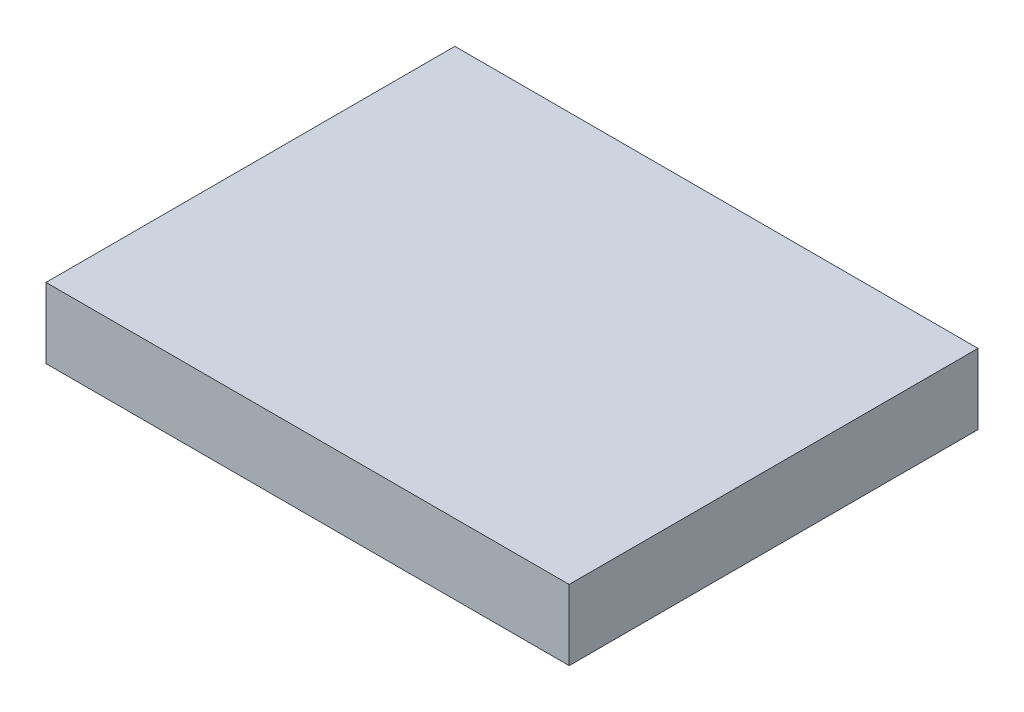
ISO-10303-21;
HEADER;
FILE_DESCRIPTION(('STEP AP214'),'2;1');
FILE_NAME('part.step','',(''),(''),'','','');
FILE_SCHEMA(('AUTOMOTIVE_DESIGN { 1 0 10303 214 1 1 1 1 }'));
ENDSEC;
DATA;
#1=APPLICATION_CONTEXT('core data for automotive mechanical design processes');
#2=APPLICATION_PROTOCOL_DEFINITION('international standard','automotive_design',2000,#1);
#3=PRODUCT_CONTEXT('',#1,'mechanical');
#4=PRODUCT('Part','Part','',(#3));
#5=PRODUCT_RELATED_PRODUCT_CATEGORY('part','',(#4));
#6=PRODUCT_DEFINITION_FORMATION('','',#4);
#7=PRODUCT_DEFINITION_CONTEXT('part definition',#1,'design');
#8=PRODUCT_DEFINITION('design','',#6,#7);
#9=PRODUCT_DEFINITION_SHAPE('','',#8);
#10=(LENGTH_UNIT() NAMED_UNIT(*) SI_UNIT(.MILLI.,.METRE.));
#11=(NAMED_UNIT(*) PLANE_ANGLE_UNIT() SI_UNIT($,.RADIAN.));
#12=(NAMED_UNIT(*) SI_UNIT($,.STERADIAN.) SOLID_ANGLE_UNIT());
#13=UNCERTAINTY_MEASURE_WITH_UNIT(LENGTH_MEASURE(1.E-05),#10,'distance_accuracy_value','');
#14=(GEOMETRIC_REPRESENTATION_CONTEXT(3) GLOBAL_UNCERTAINTY_ASSIGNED_CONTEXT((#13)) GLOBAL_UNIT_ASSIGNED_CONTEXT((#10,
#11,#12)) REPRESENTATION_CONTEXT('',''));
#15=CARTESIAN_POINT('',(0.,0.,0.));
#16=DIRECTION('',(0.,0.,1.));
#17=DIRECTION('',(1.,0.,0.));
#18=AXIS2_PLACEMENT_3D('',#15,#16,#17);
#19=CARTESIAN_POINT('',(-59.5,16.,-46.5));
#20=DIRECTION('',(1.,0.,0.));
#21=DIRECTION('',(0.,0.,-1.));
#22=AXIS2_PLACEMENT_3D('',#19,#20,#21);
#23=PLANE('',#22);
#24=DIRECTION('',(0.,0.,1.));
#25=VECTOR('',#24,1.);
#26=CARTESIAN_POINT('',(-59.5,0.,-46.5));
#27=LINE('',#26,#25);
#28=CARTESIAN_POINT('',(-59.5,0.,-46.5));
#29=VERTEX_POINT('',#28);
#30=CARTESIAN_POINT('',(-59.5,0.,46.5));
#31=VERTEX_POINT('',#30);
#32=EDGE_CURVE('E96',#29,#31,#27,.T.);
#33=ORIENTED_EDGE('',*,*,#32,.T.);
#34=DIRECTION('',(0.,-1.,0.));
#35=VECTOR('',#34,1.);
#36=CARTESIAN_POINT('',(-59.5,16.,46.5));
#37=LINE('',#36,#35);
#38=CARTESIAN_POINT('',(-59.5,16.,46.5));
#39=VERTEX_POINT('',#38);
#40=EDGE_CURVE('E11',#39,#31,#37,.T.);
#41=ORIENTED_EDGE('',*,*,#40,.F.);
#42=DIRECTION('',(0.,0.,1.));
#43=VECTOR('',#42,1.);
#44=CARTESIAN_POINT('',(-59.5,16.,-46.5));
#45=LINE('',#44,#43);
#46=CARTESIAN_POINT('',(-59.5,16.,-46.5));
#47=VERTEX_POINT('',#46);
#48=EDGE_CURVE('E84',#47,#39,#45,.T.);
#49=ORIENTED_EDGE('',*,*,#48,.F.);
#50=DIRECTION('',(0.,-1.,0.));
#51=VECTOR('',#50,1.);
#52=CARTESIAN_POINT('',(-59.5,16.,-46.5));
#53=LINE('',#52,#51);
#54=EDGE_CURVE('E92',#47,#29,#53,.T.);
#55=ORIENTED_EDGE('',*,*,#54,.T.);
#56=EDGE_LOOP('',(#33,#41,#49,#55));
#57=FACE_BOUND('',#56,.T.);
#58=ADVANCED_FACE('F33',(#57),#23,.F.);
#59=CARTESIAN_POINT('',(59.5,16.,46.5));
#60=DIRECTION('',(0.,0.,-1.));
#61=DIRECTION('',(-1.,0.,0.));
#62=AXIS2_PLACEMENT_3D('',#59,#60,#61);
#63=PLANE('',#62);
#64=DIRECTION('',(1.,0.,0.));
#65=VECTOR('',#64,1.);
#66=CARTESIAN_POINT('',(59.5,0.,46.5));
#67=LINE('',#66,#65);
#68=CARTESIAN_POINT('',(59.5,0.,46.5));
#69=VERTEX_POINT('',#68);
#70=EDGE_CURVE('E88',#31,#69,#67,.T.);
#71=ORIENTED_EDGE('',*,*,#70,.T.);
#72=DIRECTION('',(0.,-1.,0.));
#73=VECTOR('',#72,1.);
#74=CARTESIAN_POINT('',(59.5,16.,46.5));
#75=LINE('',#74,#73);
#76=CARTESIAN_POINT('',(59.5,16.,46.5));
#77=VERTEX_POINT('',#76);
#78=EDGE_CURVE('E41',#77,#69,#75,.T.);
#79=ORIENTED_EDGE('',*,*,#78,.F.);
#80=DIRECTION('',(1.,0.,0.));
#81=VECTOR('',#80,1.);
#82=CARTESIAN_POINT('',(59.5,16.,46.5));
#83=LINE('',#82,#81);
#84=EDGE_CURVE('E79',#39,#77,#83,.T.);
#85=ORIENTED_EDGE('',*,*,#84,.F.);
#86=ORIENTED_EDGE('',*,*,#40,.T.);
#87=EDGE_LOOP('',(#71,#79,#85,#86));
#88=FACE_BOUND('',#87,.T.);
#89=ADVANCED_FACE('F87',(#88),#63,.F.);
#90=CARTESIAN_POINT('',(59.5,16.,-46.5));
#91=DIRECTION('',(-1.,0.,0.));
#92=DIRECTION('',(0.,0.,1.));
#93=AXIS2_PLACEMENT_3D('',#90,#91,#92);
#94=PLANE('',#93);
#95=DIRECTION('',(0.,0.,-1.));
#96=VECTOR('',#95,1.);
#97=CARTESIAN_POINT('',(59.5,0.,-46.5));
#98=LINE('',#97,#96);
#99=CARTESIAN_POINT('',(59.5,0.,-46.5));
#100=VERTEX_POINT('',#99);
#101=EDGE_CURVE('E66',#69,#100,#98,.T.);
#102=ORIENTED_EDGE('',*,*,#101,.T.);
#103=DIRECTION('',(0.,-1.,0.));
#104=VECTOR('',#103,1.);
#105=CARTESIAN_POINT('',(59.5,16.,-46.5));
#106=LINE('',#105,#104);
#107=CARTESIAN_POINT('',(59.5,16.,-46.5));
#108=VERTEX_POINT('',#107);
#109=EDGE_CURVE('E89',#108,#100,#106,.T.);
#110=ORIENTED_EDGE('',*,*,#109,.F.);
#111=DIRECTION('',(0.,0.,-1.));
#112=VECTOR('',#111,1.);
#113=CARTESIAN_POINT('',(59.5,16.,-46.5));
#114=LINE('',#113,#112);
#115=EDGE_CURVE('E82',#77,#108,#114,.T.);
#116=ORIENTED_EDGE('',*,*,#115,.F.);
#117=ORIENTED_EDGE('',*,*,#78,.T.);
#118=EDGE_LOOP('',(#102,#110,#116,#117));
#119=FACE_BOUND('',#118,.T.);
#120=ADVANCED_FACE('F90',(#119),#94,.F.);
#121=CARTESIAN_POINT('',(59.5,16.,-46.5));
#122=DIRECTION('',(0.,0.,1.));
#123=DIRECTION('',(1.,0.,0.));
#124=AXIS2_PLACEMENT_3D('',#121,#122,#123);
#125=PLANE('',#124);
#126=DIRECTION('',(-1.,0.,0.));
#127=VECTOR('',#126,1.);
#128=CARTESIAN_POINT('',(59.5,0.,-46.5));
#129=LINE('',#128,#127);
#130=EDGE_CURVE('E72',#100,#29,#129,.T.);
#131=ORIENTED_EDGE('',*,*,#130,.T.);
#132=ORIENTED_EDGE('',*,*,#54,.F.);
#133=DIRECTION('',(-1.,0.,0.));
#134=VECTOR('',#133,1.);
#135=CARTESIAN_POINT('',(59.5,16.,-46.5));
#136=LINE('',#135,#134);
#137=EDGE_CURVE('E49',#108,#47,#136,.T.);
#138=ORIENTED_EDGE('',*,*,#137,.F.);
#139=ORIENTED_EDGE('',*,*,#109,.T.);
#140=EDGE_LOOP('',(#131,#132,#138,#139));
#141=FACE_BOUND('',#140,.T.);
#142=ADVANCED_FACE('F103',(#141),#125,.F.);
#143=CARTESIAN_POINT('',(0.,16.,0.));
#144=DIRECTION('',(0.,-1.,0.));
#145=DIRECTION('',(0.,0.,-1.));
#146=AXIS2_PLACEMENT_3D('',#143,#144,#145);
#147=PLANE('',#146);
#148=ORIENTED_EDGE('',*,*,#48,.T.);
#149=ORIENTED_EDGE('',*,*,#84,.T.);
#150=ORIENTED_EDGE('',*,*,#115,.T.);
#151=ORIENTED_EDGE('',*,*,#137,.T.);
#152=EDGE_LOOP('',(#148,#149,#150,#151));
#153=FACE_BOUND('',#152,.T.);
#154=ADVANCED_FACE('F80',(#153),#147,.F.);
#155=CARTESIAN_POINT('',(0.,0.,0.));
#156=DIRECTION('',(0.,-1.,0.));
#157=DIRECTION('',(0.,0.,-1.));
#158=AXIS2_PLACEMENT_3D('',#155,#156,#157);
#159=PLANE('',#158);
#160=ORIENTED_EDGE('',*,*,#32,.F.);
#161=ORIENTED_EDGE('',*,*,#130,.F.);
#162=ORIENTED_EDGE('',*,*,#101,.F.);
#163=ORIENTED_EDGE('',*,*,#70,.F.);
#164=EDGE_LOOP('',(#160,#161,#162,#163));
#165=FACE_BOUND('',#164,.T.);
#166=ADVANCED_FACE('F106',(#165),#159,.T.);
#167=CLOSED_SHELL('',(#58,#89,#120,#142,#154,#166));
#168=MANIFOLD_SOLID_BREP('B2',#167);
#169=ADVANCED_BREP_SHAPE_REPRESENTATION('',(#18,#168),#14);
#170=SHAPE_DEFINITION_REPRESENTATION(#9,#169);
ENDSEC;
END-ISO-10303-21;
